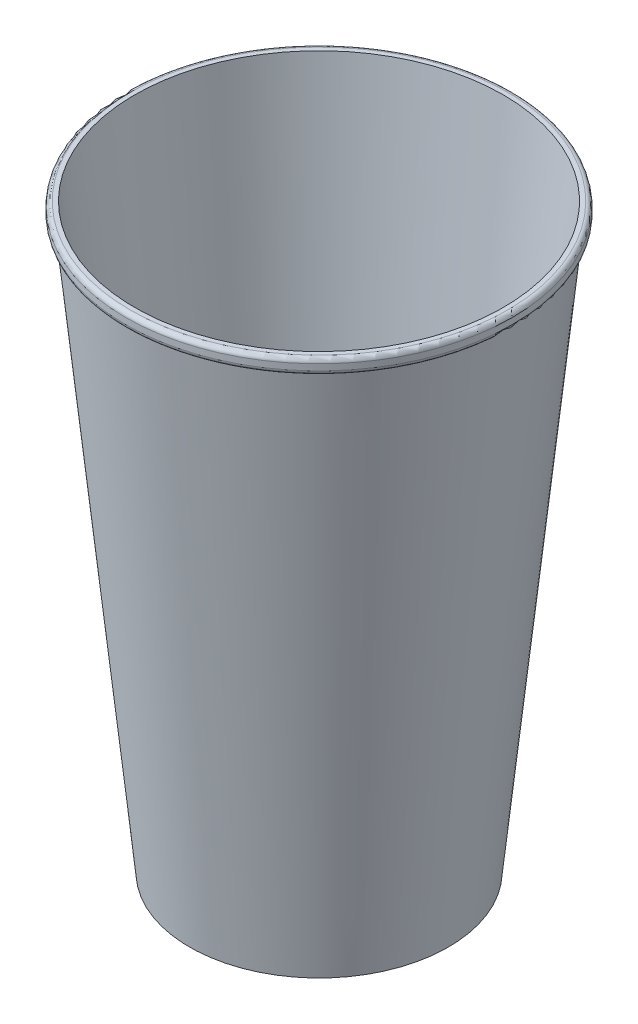
ISO-10303-21;
HEADER;
FILE_DESCRIPTION(('STEP AP214'),'2;1');
FILE_NAME('part.step','',(''),(''),'','','');
FILE_SCHEMA(('AUTOMOTIVE_DESIGN { 1 0 10303 214 1 1 1 1 }'));
ENDSEC;
DATA;
#1=APPLICATION_CONTEXT('core data for automotive mechanical design processes');
#2=APPLICATION_PROTOCOL_DEFINITION('international standard','automotive_design',2000,#1);
#3=PRODUCT_CONTEXT('',#1,'mechanical');
#4=PRODUCT('Part','Part','',(#3));
#5=PRODUCT_RELATED_PRODUCT_CATEGORY('part','',(#4));
#6=PRODUCT_DEFINITION_FORMATION('','',#4);
#7=PRODUCT_DEFINITION_CONTEXT('part definition',#1,'design');
#8=PRODUCT_DEFINITION('design','',#6,#7);
#9=PRODUCT_DEFINITION_SHAPE('','',#8);
#10=(LENGTH_UNIT() NAMED_UNIT(*) SI_UNIT(.MILLI.,.METRE.));
#11=(NAMED_UNIT(*) PLANE_ANGLE_UNIT() SI_UNIT($,.RADIAN.));
#12=(NAMED_UNIT(*) SI_UNIT($,.STERADIAN.) SOLID_ANGLE_UNIT());
#13=UNCERTAINTY_MEASURE_WITH_UNIT(LENGTH_MEASURE(1.E-05),#10,'distance_accuracy_value','');
#14=(GEOMETRIC_REPRESENTATION_CONTEXT(3) GLOBAL_UNCERTAINTY_ASSIGNED_CONTEXT((#13)) GLOBAL_UNIT_ASSIGNED_CONTEXT((#10,
#11,#12)) REPRESENTATION_CONTEXT('',''));
#15=CARTESIAN_POINT('',(0.,0.,0.));
#16=DIRECTION('',(0.,0.,1.));
#17=DIRECTION('',(1.,0.,0.));
#18=AXIS2_PLACEMENT_3D('',#15,#16,#17);
#19=CARTESIAN_POINT('',(29.505177058272,0.,0.));
#20=DIRECTION('',(0.,-1.,0.));
#21=DIRECTION('',(0.,0.,-1.));
#22=AXIS2_PLACEMENT_3D('',#19,#20,#21);
#23=PLANE('',#22);
#24=CARTESIAN_POINT('',(0.,0.,0.));
#25=DIRECTION('',(0.,-1.,0.));
#26=DIRECTION('',(0.,0.,-1.));
#27=AXIS2_PLACEMENT_3D('',#24,#25,#26);
#28=CIRCLE('',#27,29.505177058272);
#29=CARTESIAN_POINT('',(0.,0.,-29.505177058272));
#30=VERTEX_POINT('',#29);
#31=EDGE_CURVE('E71',#30,#30,#28,.T.);
#32=ORIENTED_EDGE('',*,*,#31,.T.);
#33=EDGE_LOOP('',(#32));
#34=FACE_BOUND('',#33,.T.);
#35=CARTESIAN_POINT('',(0.,0.,0.));
#36=DIRECTION('',(0.,-1.,0.));
#37=DIRECTION('',(0.,0.,-1.));
#38=AXIS2_PLACEMENT_3D('',#35,#36,#37);
#39=CIRCLE('',#38,28.5);
#40=CARTESIAN_POINT('',(0.,0.,-28.5));
#41=VERTEX_POINT('',#40);
#42=EDGE_CURVE('E91',#41,#41,#39,.T.);
#43=ORIENTED_EDGE('',*,*,#42,.F.);
#44=EDGE_LOOP('',(#43));
#45=FACE_BOUND('',#44,.T.);
#46=ADVANCED_FACE('F47',(#34,#45),#23,.T.);
#47=CARTESIAN_POINT('',(0.,0.,0.));
#48=DIRECTION('',(0.,1.,0.));
#49=DIRECTION('',(0.,0.,1.));
#50=AXIS2_PLACEMENT_3D('',#47,#48,#49);
#51=CONICAL_SURFACE('',#50,29.505177058272,0.101536412739867);
#52=CARTESIAN_POINT('',(0.,129.1,0.));
#53=DIRECTION('',(0.,-1.,0.));
#54=DIRECTION('',(0.,0.,-1.));
#55=AXIS2_PLACEMENT_3D('',#52,#53,#54);
#56=CIRCLE('',#55,42.6587619639323);
#57=CARTESIAN_POINT('',(0.,129.1,-42.6587619639323));
#58=VERTEX_POINT('',#57);
#59=EDGE_CURVE('E80',#58,#58,#56,.T.);
#60=ORIENTED_EDGE('',*,*,#59,.T.);
#61=EDGE_LOOP('',(#60));
#62=FACE_BOUND('',#61,.T.);
#63=ORIENTED_EDGE('',*,*,#31,.F.);
#64=EDGE_LOOP('',(#63));
#65=FACE_BOUND('',#64,.T.);
#66=ADVANCED_FACE('F105',(#62,#65),#51,.T.);
#67=CARTESIAN_POINT('',(42.6587619639323,129.1,0.));
#68=DIRECTION('',(0.,-1.,0.));
#69=DIRECTION('',(0.,0.,-1.));
#70=AXIS2_PLACEMENT_3D('',#67,#68,#69);
#71=PLANE('',#70);
#72=CARTESIAN_POINT('',(0.,129.1,0.));
#73=DIRECTION('',(0.,-1.,0.));
#74=DIRECTION('',(0.,0.,-1.));
#75=AXIS2_PLACEMENT_3D('',#72,#73,#74);
#76=CIRCLE('',#75,43.);
#77=CARTESIAN_POINT('',(0.,129.1,-43.));
#78=VERTEX_POINT('',#77);
#79=EDGE_CURVE('E70',#78,#78,#76,.T.);
#80=ORIENTED_EDGE('',*,*,#79,.T.);
#81=EDGE_LOOP('',(#80));
#82=FACE_BOUND('',#81,.T.);
#83=ORIENTED_EDGE('',*,*,#59,.F.);
#84=EDGE_LOOP('',(#83));
#85=FACE_BOUND('',#84,.T.);
#86=ADVANCED_FACE('F107',(#82,#85),#71,.T.);
#87=CARTESIAN_POINT('',(0.,0.,0.));
#88=DIRECTION('',(0.,-1.,0.));
#89=DIRECTION('',(0.,0.,-1.));
#90=AXIS2_PLACEMENT_3D('',#87,#88,#89);
#91=CYLINDRICAL_SURFACE('',#90,44.);
#92=CARTESIAN_POINT('',(0.,130.1,0.));
#93=DIRECTION('',(0.,-1.,0.));
#94=DIRECTION('',(0.,0.,-1.));
#95=AXIS2_PLACEMENT_3D('',#92,#93,#94);
#96=CIRCLE('',#95,44.);
#97=CARTESIAN_POINT('',(0.,130.1,-44.));
#98=VERTEX_POINT('',#97);
#99=EDGE_CURVE('E60',#98,#98,#96,.F.);
#100=ORIENTED_EDGE('',*,*,#99,.T.);
#101=EDGE_LOOP('',(#100));
#102=FACE_BOUND('',#101,.T.);
#103=CARTESIAN_POINT('',(0.,131.5,0.));
#104=DIRECTION('',(0.,1.,0.));
#105=DIRECTION('',(0.,0.,1.));
#106=AXIS2_PLACEMENT_3D('',#103,#104,#105);
#107=CIRCLE('',#106,44.);
#108=CARTESIAN_POINT('',(0.,131.5,44.));
#109=VERTEX_POINT('',#108);
#110=EDGE_CURVE('E65',#109,#109,#107,.F.);
#111=ORIENTED_EDGE('',*,*,#110,.T.);
#112=EDGE_LOOP('',(#111));
#113=FACE_BOUND('',#112,.T.);
#114=ADVANCED_FACE('F130',(#102,#113),#91,.T.);
#115=CARTESIAN_POINT('',(42.,132.5,0.));
#116=DIRECTION('',(0.,1.,0.));
#117=DIRECTION('',(0.,0.,1.));
#118=AXIS2_PLACEMENT_3D('',#115,#116,#117);
#119=PLANE('',#118);
#120=CARTESIAN_POINT('',(0.,132.5,0.));
#121=DIRECTION('',(0.,1.,0.));
#122=DIRECTION('',(0.,0.,1.));
#123=AXIS2_PLACEMENT_3D('',#120,#121,#122);
#124=CIRCLE('',#123,43.);
#125=CARTESIAN_POINT('',(0.,132.5,43.));
#126=VERTEX_POINT('',#125);
#127=EDGE_CURVE('E10',#126,#126,#124,.T.);
#128=ORIENTED_EDGE('',*,*,#127,.T.);
#129=EDGE_LOOP('',(#128));
#130=FACE_BOUND('',#129,.T.);
#131=CARTESIAN_POINT('',(0.,132.5,0.));
#132=DIRECTION('',(0.,-1.,0.));
#133=DIRECTION('',(0.,0.,-1.));
#134=AXIS2_PLACEMENT_3D('',#131,#132,#133);
#135=CIRCLE('',#134,42.);
#136=CARTESIAN_POINT('',(0.,132.5,-42.));
#137=VERTEX_POINT('',#136);
#138=EDGE_CURVE('E82',#137,#137,#135,.T.);
#139=ORIENTED_EDGE('',*,*,#138,.T.);
#140=EDGE_LOOP('',(#139));
#141=FACE_BOUND('',#140,.T.);
#142=ADVANCED_FACE('F137',(#130,#141),#119,.T.);
#143=CARTESIAN_POINT('',(0.,132.5,0.));
#144=DIRECTION('',(0.,1.,0.));
#145=DIRECTION('',(0.,0.,1.));
#146=AXIS2_PLACEMENT_3D('',#143,#144,#145);
#147=CONICAL_SURFACE('',#146,42.,0.101536412739867);
#148=CARTESIAN_POINT('',(0.,7.5,0.));
#149=DIRECTION('',(0.,-1.,0.));
#150=DIRECTION('',(0.,0.,-1.));
#151=AXIS2_PLACEMENT_3D('',#148,#149,#150);
#152=CIRCLE('',#151,29.2641509433962);
#153=CARTESIAN_POINT('',(0.,7.5,-29.2641509433962));
#154=VERTEX_POINT('',#153);
#155=EDGE_CURVE('E83',#154,#154,#152,.T.);
#156=ORIENTED_EDGE('',*,*,#155,.T.);
#157=EDGE_LOOP('',(#156));
#158=FACE_BOUND('',#157,.T.);
#159=ORIENTED_EDGE('',*,*,#138,.F.);
#160=EDGE_LOOP('',(#159));
#161=FACE_BOUND('',#160,.T.);
#162=ADVANCED_FACE('F143',(#158,#161),#147,.F.);
#163=CARTESIAN_POINT('',(0.,7.5,0.));
#164=DIRECTION('',(0.,1.,0.));
#165=DIRECTION('',(0.,0.,1.));
#166=AXIS2_PLACEMENT_3D('',#163,#164,#165);
#167=PLANE('',#166);
#168=ORIENTED_EDGE('',*,*,#155,.F.);
#169=EDGE_LOOP('',(#168));
#170=FACE_BOUND('',#169,.T.);
#171=ADVANCED_FACE('F145',(#170),#167,.T.);
#172=CARTESIAN_POINT('',(29.1622641509434,6.5,0.));
#173=DIRECTION('',(0.,-1.,0.));
#174=DIRECTION('',(0.,0.,-1.));
#175=AXIS2_PLACEMENT_3D('',#172,#173,#174);
#176=PLANE('',#175);
#177=CARTESIAN_POINT('',(0.,6.5,0.));
#178=DIRECTION('',(0.,-1.,0.));
#179=DIRECTION('',(0.,0.,-1.));
#180=AXIS2_PLACEMENT_3D('',#177,#178,#179);
#181=CIRCLE('',#180,29.1622641509434);
#182=CARTESIAN_POINT('',(0.,6.5,-29.1622641509434));
#183=VERTEX_POINT('',#182);
#184=EDGE_CURVE('E90',#183,#183,#181,.T.);
#185=ORIENTED_EDGE('',*,*,#184,.T.);
#186=EDGE_LOOP('',(#185));
#187=FACE_BOUND('',#186,.T.);
#188=ADVANCED_FACE('F119',(#187),#176,.T.);
#189=CARTESIAN_POINT('',(0.,6.5,0.));
#190=DIRECTION('',(0.,1.,0.));
#191=DIRECTION('',(0.,0.,1.));
#192=AXIS2_PLACEMENT_3D('',#189,#190,#191);
#193=CONICAL_SURFACE('',#192,29.1622641509434,0.101536412739867);
#194=ORIENTED_EDGE('',*,*,#42,.T.);
#195=EDGE_LOOP('',(#194));
#196=FACE_BOUND('',#195,.T.);
#197=ORIENTED_EDGE('',*,*,#184,.F.);
#198=EDGE_LOOP('',(#197));
#199=FACE_BOUND('',#198,.T.);
#200=ADVANCED_FACE('F98',(#196,#199),#193,.F.);
#201=CARTESIAN_POINT('',(0.,130.1,0.));
#202=DIRECTION('',(0.,-1.,0.));
#203=DIRECTION('',(0.,0.,-1.));
#204=AXIS2_PLACEMENT_3D('',#201,#202,#203);
#205=TOROIDAL_SURFACE('',#204,43.,1.);
#206=ORIENTED_EDGE('',*,*,#99,.F.);
#207=EDGE_LOOP('',(#206));
#208=FACE_BOUND('',#207,.T.);
#209=ORIENTED_EDGE('',*,*,#79,.F.);
#210=EDGE_LOOP('',(#209));
#211=FACE_BOUND('',#210,.T.);
#212=ADVANCED_FACE('F115',(#208,#211),#205,.T.);
#213=CARTESIAN_POINT('',(0.,131.5,0.));
#214=DIRECTION('',(0.,1.,0.));
#215=DIRECTION('',(0.,0.,1.));
#216=AXIS2_PLACEMENT_3D('',#213,#214,#215);
#217=TOROIDAL_SURFACE('',#216,43.,1.);
#218=ORIENTED_EDGE('',*,*,#127,.F.);
#219=EDGE_LOOP('',(#218));
#220=FACE_BOUND('',#219,.T.);
#221=ORIENTED_EDGE('',*,*,#110,.F.);
#222=EDGE_LOOP('',(#221));
#223=FACE_BOUND('',#222,.T.);
#224=ADVANCED_FACE('F51',(#220,#223),#217,.T.);
#225=CLOSED_SHELL('',(#46,#66,#86,#114,#142,#162,#171,#188,#200,#212,#224));
#226=MANIFOLD_SOLID_BREP('B2',#225);
#227=ADVANCED_BREP_SHAPE_REPRESENTATION('',(#18,#226),#14);
#228=SHAPE_DEFINITION_REPRESENTATION(#9,#227);
ENDSEC;
END-ISO-10303-21;
